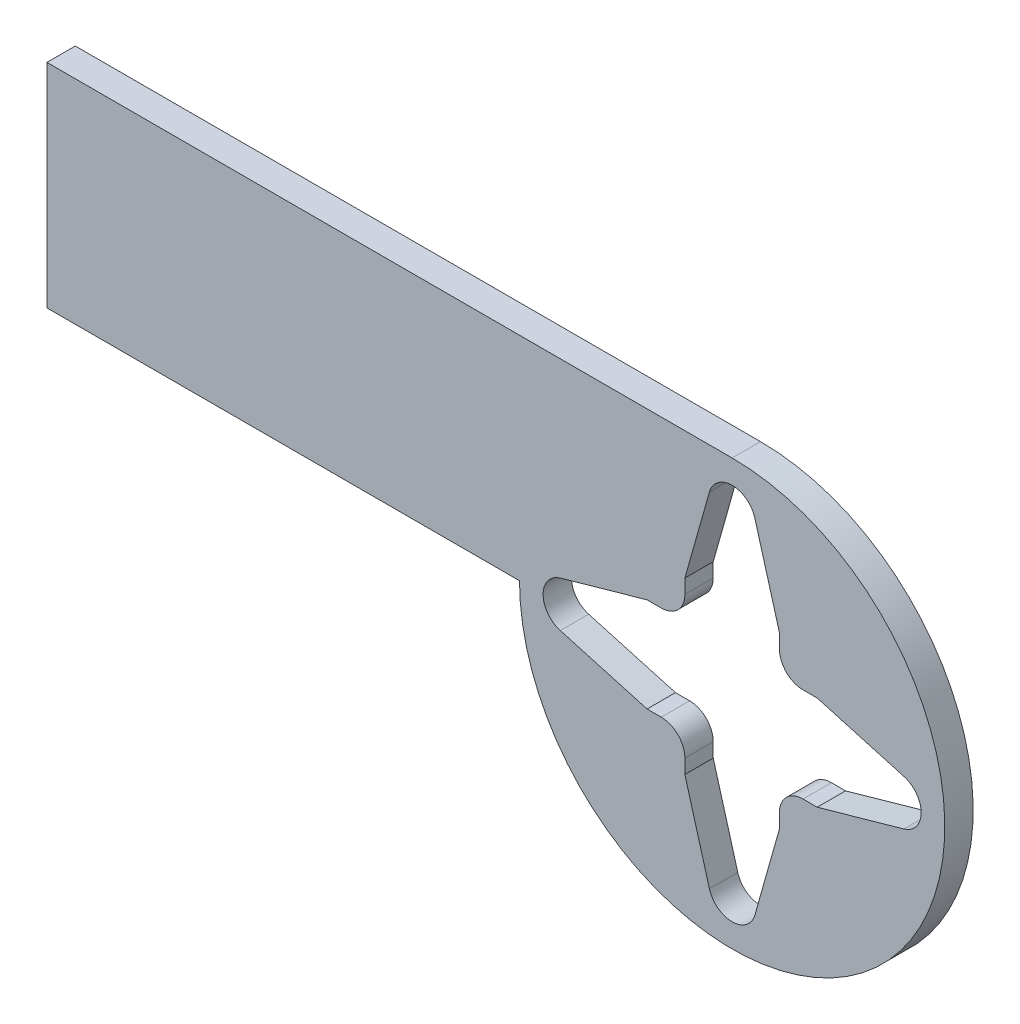
ISO-10303-21;
HEADER;
FILE_DESCRIPTION(('STEP AP214'),'2;1');
FILE_NAME('part.step','',(''),(''),'','','');
FILE_SCHEMA(('AUTOMOTIVE_DESIGN { 1 0 10303 214 1 1 1 1 }'));
ENDSEC;
DATA;
#1=APPLICATION_CONTEXT('core data for automotive mechanical design processes');
#2=APPLICATION_PROTOCOL_DEFINITION('international standard','automotive_design',2000,#1);
#3=PRODUCT_CONTEXT('',#1,'mechanical');
#4=PRODUCT('Part','Part','',(#3));
#5=PRODUCT_RELATED_PRODUCT_CATEGORY('part','',(#4));
#6=PRODUCT_DEFINITION_FORMATION('','',#4);
#7=PRODUCT_DEFINITION_CONTEXT('part definition',#1,'design');
#8=PRODUCT_DEFINITION('design','',#6,#7);
#9=PRODUCT_DEFINITION_SHAPE('','',#8);
#10=(LENGTH_UNIT() NAMED_UNIT(*) SI_UNIT(.MILLI.,.METRE.));
#11=(NAMED_UNIT(*) PLANE_ANGLE_UNIT() SI_UNIT($,.RADIAN.));
#12=(NAMED_UNIT(*) SI_UNIT($,.STERADIAN.) SOLID_ANGLE_UNIT());
#13=UNCERTAINTY_MEASURE_WITH_UNIT(LENGTH_MEASURE(1.E-05),#10,'distance_accuracy_value','');
#14=(GEOMETRIC_REPRESENTATION_CONTEXT(3) GLOBAL_UNCERTAINTY_ASSIGNED_CONTEXT((#13)) GLOBAL_UNIT_ASSIGNED_CONTEXT((#10,
#11,#12)) REPRESENTATION_CONTEXT('',''));
#15=CARTESIAN_POINT('',(0.,0.,0.));
#16=DIRECTION('',(0.,0.,1.));
#17=DIRECTION('',(1.,0.,0.));
#18=AXIS2_PLACEMENT_3D('',#15,#16,#17);
#19=CARTESIAN_POINT('',(0.,0.,3.));
#20=DIRECTION('',(0.,0.,-1.));
#21=DIRECTION('',(-1.,0.,0.));
#22=AXIS2_PLACEMENT_3D('',#19,#20,#21);
#23=CYLINDRICAL_SURFACE('',#22,22.5);
#24=CARTESIAN_POINT('',(0.,0.,0.));
#25=DIRECTION('',(0.,0.,1.));
#26=DIRECTION('',(1.,0.,0.));
#27=AXIS2_PLACEMENT_3D('',#24,#25,#26);
#28=CIRCLE('',#27,22.5);
#29=CARTESIAN_POINT('',(-22.5,0.,0.));
#30=VERTEX_POINT('',#29);
#31=CARTESIAN_POINT('',(0.,22.5,0.));
#32=VERTEX_POINT('',#31);
#33=EDGE_CURVE('E395',#30,#32,#28,.T.);
#34=ORIENTED_EDGE('',*,*,#33,.T.);
#35=DIRECTION('',(0.,0.,-1.));
#36=VECTOR('',#35,1.);
#37=CARTESIAN_POINT('',(0.,22.5,3.));
#38=LINE('',#37,#36);
#39=CARTESIAN_POINT('',(0.,22.5,3.));
#40=VERTEX_POINT('',#39);
#41=EDGE_CURVE('E142',#40,#32,#38,.T.);
#42=ORIENTED_EDGE('',*,*,#41,.F.);
#43=CARTESIAN_POINT('',(0.,0.,3.));
#44=DIRECTION('',(0.,0.,1.));
#45=DIRECTION('',(1.,0.,0.));
#46=AXIS2_PLACEMENT_3D('',#43,#44,#45);
#47=CIRCLE('',#46,22.5);
#48=CARTESIAN_POINT('',(-22.5,0.,3.));
#49=VERTEX_POINT('',#48);
#50=EDGE_CURVE('E391',#49,#40,#47,.T.);
#51=ORIENTED_EDGE('',*,*,#50,.F.);
#52=DIRECTION('',(0.,0.,-1.));
#53=VECTOR('',#52,1.);
#54=CARTESIAN_POINT('',(-22.5,0.,3.));
#55=LINE('',#54,#53);
#56=EDGE_CURVE('E12',#49,#30,#55,.T.);
#57=ORIENTED_EDGE('',*,*,#56,.T.);
#58=EDGE_LOOP('',(#34,#42,#51,#57));
#59=FACE_BOUND('',#58,.T.);
#60=ADVANCED_FACE('F131',(#59),#23,.T.);
#61=CARTESIAN_POINT('',(5.,0.,3.));
#62=DIRECTION('',(1.,0.,0.));
#63=DIRECTION('',(0.,0.,-1.));
#64=AXIS2_PLACEMENT_3D('',#61,#62,#63);
#65=PLANE('',#64);
#66=DIRECTION('',(0.,-1.,0.));
#67=VECTOR('',#66,1.);
#68=CARTESIAN_POINT('',(5.,0.,0.));
#69=LINE('',#68,#67);
#70=CARTESIAN_POINT('',(5.,-7.5,0.));
#71=VERTEX_POINT('',#70);
#72=CARTESIAN_POINT('',(5.,-9.,0.));
#73=VERTEX_POINT('',#72);
#74=EDGE_CURVE('E313',#71,#73,#69,.T.);
#75=ORIENTED_EDGE('',*,*,#74,.T.);
#76=DIRECTION('',(0.,0.,-1.));
#77=VECTOR('',#76,1.);
#78=CARTESIAN_POINT('',(5.,-9.,3.));
#79=LINE('',#78,#77);
#80=CARTESIAN_POINT('',(5.,-9.,3.));
#81=VERTEX_POINT('',#80);
#82=EDGE_CURVE('E317',#81,#73,#79,.T.);
#83=ORIENTED_EDGE('',*,*,#82,.F.);
#84=DIRECTION('',(0.,-1.,0.));
#85=VECTOR('',#84,1.);
#86=CARTESIAN_POINT('',(5.,0.,3.));
#87=LINE('',#86,#85);
#88=CARTESIAN_POINT('',(5.,-7.5,3.));
#89=VERTEX_POINT('',#88);
#90=EDGE_CURVE('E398',#89,#81,#87,.T.);
#91=ORIENTED_EDGE('',*,*,#90,.F.);
#92=DIRECTION('',(0.,0.,-1.));
#93=VECTOR('',#92,1.);
#94=CARTESIAN_POINT('',(5.,-7.5,3.));
#95=LINE('',#94,#93);
#96=EDGE_CURVE('E314',#89,#71,#95,.T.);
#97=ORIENTED_EDGE('',*,*,#96,.T.);
#98=EDGE_LOOP('',(#75,#83,#91,#97));
#99=FACE_BOUND('',#98,.T.);
#100=ADVANCED_FACE('F566',(#99),#65,.F.);
#101=CARTESIAN_POINT('',(6.98551163473582,-1.97409711694024,3.));
#102=DIRECTION('',(0.962311898410698,-0.271948175535705,0.));
#103=DIRECTION('',(0.271948175535705,0.962311898410698,0.));
#104=AXIS2_PLACEMENT_3D('',#101,#102,#103);
#105=PLANE('',#104);
#106=DIRECTION('',(-0.271948175535705,-0.962311898410698,0.));
#107=VECTOR('',#106,1.);
#108=CARTESIAN_POINT('',(6.98551163473582,-1.97409711694024,0.));
#109=LINE('',#108,#107);
#110=CARTESIAN_POINT('',(2.40577974602674,-18.1798704388393,0.));
#111=VERTEX_POINT('',#110);
#112=EDGE_CURVE('E467',#73,#111,#109,.T.);
#113=ORIENTED_EDGE('',*,*,#112,.T.);
#114=DIRECTION('',(0.,0.,-1.));
#115=VECTOR('',#114,1.);
#116=CARTESIAN_POINT('',(2.40577974602674,-18.1798704388393,3.));
#117=LINE('',#116,#115);
#118=CARTESIAN_POINT('',(2.40577974602674,-18.1798704388393,3.));
#119=VERTEX_POINT('',#118);
#120=EDGE_CURVE('E321',#119,#111,#117,.T.);
#121=ORIENTED_EDGE('',*,*,#120,.F.);
#122=DIRECTION('',(-0.271948175535705,-0.962311898410698,0.));
#123=VECTOR('',#122,1.);
#124=CARTESIAN_POINT('',(6.98551163473582,-1.97409711694024,3.));
#125=LINE('',#124,#123);
#126=EDGE_CURVE('E547',#81,#119,#125,.T.);
#127=ORIENTED_EDGE('',*,*,#126,.F.);
#128=ORIENTED_EDGE('',*,*,#82,.T.);
#129=EDGE_LOOP('',(#113,#121,#127,#128));
#130=FACE_BOUND('',#129,.T.);
#131=ADVANCED_FACE('F570',(#130),#105,.F.);
#132=CARTESIAN_POINT('',(0.,-17.5,3.));
#133=DIRECTION('',(0.,0.,-1.));
#134=DIRECTION('',(-1.,0.,0.));
#135=AXIS2_PLACEMENT_3D('',#132,#133,#134);
#136=CYLINDRICAL_SURFACE('',#135,2.5);
#137=CARTESIAN_POINT('',(0.,-17.5,0.));
#138=DIRECTION('',(0.,0.,1.));
#139=DIRECTION('',(1.,0.,0.));
#140=AXIS2_PLACEMENT_3D('',#137,#138,#139);
#141=CIRCLE('',#140,2.5);
#142=CARTESIAN_POINT('',(-2.40577974602674,-18.1798704388393,0.));
#143=VERTEX_POINT('',#142);
#144=EDGE_CURVE('E463',#111,#143,#141,.F.);
#145=ORIENTED_EDGE('',*,*,#144,.T.);
#146=DIRECTION('',(0.,0.,-1.));
#147=VECTOR('',#146,1.);
#148=CARTESIAN_POINT('',(-2.40577974602674,-18.1798704388393,3.));
#149=LINE('',#148,#147);
#150=CARTESIAN_POINT('',(-2.40577974602674,-18.1798704388393,3.));
#151=VERTEX_POINT('',#150);
#152=EDGE_CURVE('E325',#151,#143,#149,.T.);
#153=ORIENTED_EDGE('',*,*,#152,.F.);
#154=CARTESIAN_POINT('',(0.,-17.5,3.));
#155=DIRECTION('',(0.,0.,1.));
#156=DIRECTION('',(1.,0.,0.));
#157=AXIS2_PLACEMENT_3D('',#154,#155,#156);
#158=CIRCLE('',#157,2.5);
#159=EDGE_CURVE('E543',#119,#151,#158,.F.);
#160=ORIENTED_EDGE('',*,*,#159,.F.);
#161=ORIENTED_EDGE('',*,*,#120,.T.);
#162=EDGE_LOOP('',(#145,#153,#160,#161));
#163=FACE_BOUND('',#162,.T.);
#164=ADVANCED_FACE('F577',(#163),#136,.F.);
#165=CARTESIAN_POINT('',(-6.98551163473582,-1.97409711694024,3.));
#166=DIRECTION('',(0.962311898410698,0.271948175535705,0.));
#167=DIRECTION('',(-0.271948175535705,0.962311898410698,0.));
#168=AXIS2_PLACEMENT_3D('',#165,#166,#167);
#169=PLANE('',#168);
#170=DIRECTION('',(0.271948175535705,-0.962311898410698,0.));
#171=VECTOR('',#170,1.);
#172=CARTESIAN_POINT('',(-6.98551163473582,-1.97409711694024,0.));
#173=LINE('',#172,#171);
#174=CARTESIAN_POINT('',(-5.,-9.,0.));
#175=VERTEX_POINT('',#174);
#176=EDGE_CURVE('E459',#175,#143,#173,.T.);
#177=ORIENTED_EDGE('',*,*,#176,.F.);
#178=DIRECTION('',(0.,0.,-1.));
#179=VECTOR('',#178,1.);
#180=CARTESIAN_POINT('',(-5.,-9.,3.));
#181=LINE('',#180,#179);
#182=CARTESIAN_POINT('',(-5.,-9.,3.));
#183=VERTEX_POINT('',#182);
#184=EDGE_CURVE('E328',#183,#175,#181,.T.);
#185=ORIENTED_EDGE('',*,*,#184,.F.);
#186=DIRECTION('',(0.271948175535705,-0.962311898410698,0.));
#187=VECTOR('',#186,1.);
#188=CARTESIAN_POINT('',(-6.98551163473582,-1.97409711694024,3.));
#189=LINE('',#188,#187);
#190=EDGE_CURVE('E539',#183,#151,#189,.T.);
#191=ORIENTED_EDGE('',*,*,#190,.T.);
#192=ORIENTED_EDGE('',*,*,#152,.T.);
#193=EDGE_LOOP('',(#177,#185,#191,#192));
#194=FACE_BOUND('',#193,.T.);
#195=ADVANCED_FACE('F649',(#194),#169,.T.);
#196=CARTESIAN_POINT('',(-5.,0.,3.));
#197=DIRECTION('',(1.,0.,0.));
#198=DIRECTION('',(0.,0.,-1.));
#199=AXIS2_PLACEMENT_3D('',#196,#197,#198);
#200=PLANE('',#199);
#201=DIRECTION('',(0.,-1.,0.));
#202=VECTOR('',#201,1.);
#203=CARTESIAN_POINT('',(-5.,0.,0.));
#204=LINE('',#203,#202);
#205=CARTESIAN_POINT('',(-5.,-7.5,0.));
#206=VERTEX_POINT('',#205);
#207=EDGE_CURVE('E455',#206,#175,#204,.T.);
#208=ORIENTED_EDGE('',*,*,#207,.F.);
#209=DIRECTION('',(0.,0.,-1.));
#210=VECTOR('',#209,1.);
#211=CARTESIAN_POINT('',(-5.,-7.5,3.));
#212=LINE('',#211,#210);
#213=CARTESIAN_POINT('',(-5.,-7.5,3.));
#214=VERTEX_POINT('',#213);
#215=EDGE_CURVE('E331',#214,#206,#212,.T.);
#216=ORIENTED_EDGE('',*,*,#215,.F.);
#217=DIRECTION('',(0.,-1.,0.));
#218=VECTOR('',#217,1.);
#219=CARTESIAN_POINT('',(-5.,0.,3.));
#220=LINE('',#219,#218);
#221=EDGE_CURVE('E535',#214,#183,#220,.T.);
#222=ORIENTED_EDGE('',*,*,#221,.T.);
#223=ORIENTED_EDGE('',*,*,#184,.T.);
#224=EDGE_LOOP('',(#208,#216,#222,#223));
#225=FACE_BOUND('',#224,.T.);
#226=ADVANCED_FACE('F651',(#225),#200,.T.);
#227=CARTESIAN_POINT('',(0.,-5.,3.));
#228=DIRECTION('',(0.,-1.,0.));
#229=DIRECTION('',(1.,0.,0.));
#230=AXIS2_PLACEMENT_3D('',#227,#228,#229);
#231=PLANE('',#230);
#232=DIRECTION('',(-1.,0.,0.));
#233=VECTOR('',#232,1.);
#234=CARTESIAN_POINT('',(0.,-5.,0.));
#235=LINE('',#234,#233);
#236=CARTESIAN_POINT('',(-7.5,-5.,0.));
#237=VERTEX_POINT('',#236);
#238=CARTESIAN_POINT('',(-9.,-5.,0.));
#239=VERTEX_POINT('',#238);
#240=EDGE_CURVE('E452',#237,#239,#235,.T.);
#241=ORIENTED_EDGE('',*,*,#240,.T.);
#242=DIRECTION('',(0.,0.,-1.));
#243=VECTOR('',#242,1.);
#244=CARTESIAN_POINT('',(-9.,-5.,3.));
#245=LINE('',#244,#243);
#246=CARTESIAN_POINT('',(-9.,-5.,3.));
#247=VERTEX_POINT('',#246);
#248=EDGE_CURVE('E337',#247,#239,#245,.T.);
#249=ORIENTED_EDGE('',*,*,#248,.F.);
#250=DIRECTION('',(-1.,0.,0.));
#251=VECTOR('',#250,1.);
#252=CARTESIAN_POINT('',(0.,-5.,3.));
#253=LINE('',#252,#251);
#254=CARTESIAN_POINT('',(-7.5,-5.,3.));
#255=VERTEX_POINT('',#254);
#256=EDGE_CURVE('E531',#255,#247,#253,.T.);
#257=ORIENTED_EDGE('',*,*,#256,.F.);
#258=DIRECTION('',(0.,0.,-1.));
#259=VECTOR('',#258,1.);
#260=CARTESIAN_POINT('',(-7.5,-5.,3.));
#261=LINE('',#260,#259);
#262=EDGE_CURVE('E334',#255,#237,#261,.T.);
#263=ORIENTED_EDGE('',*,*,#262,.T.);
#264=EDGE_LOOP('',(#241,#249,#257,#263));
#265=FACE_BOUND('',#264,.T.);
#266=ADVANCED_FACE('F657',(#265),#231,.F.);
#267=CARTESIAN_POINT('',(-1.97409711694023,-6.98551163473581,3.));
#268=DIRECTION('',(-0.271948175535704,-0.962311898410698,0.));
#269=DIRECTION('',(0.962311898410698,-0.271948175535704,0.));
#270=AXIS2_PLACEMENT_3D('',#267,#268,#269);
#271=PLANE('',#270);
#272=DIRECTION('',(-0.962311898410698,0.271948175535704,0.));
#273=VECTOR('',#272,1.);
#274=CARTESIAN_POINT('',(-1.97409711694023,-6.98551163473581,0.));
#275=LINE('',#274,#273);
#276=CARTESIAN_POINT('',(-18.1798704388393,-2.40577974602675,0.));
#277=VERTEX_POINT('',#276);
#278=EDGE_CURVE('E449',#239,#277,#275,.T.);
#279=ORIENTED_EDGE('',*,*,#278,.T.);
#280=DIRECTION('',(0.,0.,-1.));
#281=VECTOR('',#280,1.);
#282=CARTESIAN_POINT('',(-18.1798704388393,-2.40577974602675,3.));
#283=LINE('',#282,#281);
#284=CARTESIAN_POINT('',(-18.1798704388393,-2.40577974602675,3.));
#285=VERTEX_POINT('',#284);
#286=EDGE_CURVE('E341',#285,#277,#283,.T.);
#287=ORIENTED_EDGE('',*,*,#286,.F.);
#288=DIRECTION('',(-0.962311898410698,0.271948175535704,0.));
#289=VECTOR('',#288,1.);
#290=CARTESIAN_POINT('',(-1.97409711694023,-6.98551163473581,3.));
#291=LINE('',#290,#289);
#292=EDGE_CURVE('E527',#247,#285,#291,.T.);
#293=ORIENTED_EDGE('',*,*,#292,.F.);
#294=ORIENTED_EDGE('',*,*,#248,.T.);
#295=EDGE_LOOP('',(#279,#287,#293,#294));
#296=FACE_BOUND('',#295,.T.);
#297=ADVANCED_FACE('F664',(#296),#271,.F.);
#298=CARTESIAN_POINT('',(-17.5,0.,3.));
#299=DIRECTION('',(0.,0.,-1.));
#300=DIRECTION('',(-1.,0.,0.));
#301=AXIS2_PLACEMENT_3D('',#298,#299,#300);
#302=CYLINDRICAL_SURFACE('',#301,2.5);
#303=CARTESIAN_POINT('',(-17.5,0.,0.));
#304=DIRECTION('',(0.,0.,1.));
#305=DIRECTION('',(1.,0.,0.));
#306=AXIS2_PLACEMENT_3D('',#303,#304,#305);
#307=CIRCLE('',#306,2.5);
#308=CARTESIAN_POINT('',(-18.1798704388393,2.40577974602675,0.));
#309=VERTEX_POINT('',#308);
#310=EDGE_CURVE('E445',#277,#309,#307,.F.);
#311=ORIENTED_EDGE('',*,*,#310,.T.);
#312=DIRECTION('',(0.,0.,-1.));
#313=VECTOR('',#312,1.);
#314=CARTESIAN_POINT('',(-18.1798704388393,2.40577974602675,3.));
#315=LINE('',#314,#313);
#316=CARTESIAN_POINT('',(-18.1798704388393,2.40577974602675,3.));
#317=VERTEX_POINT('',#316);
#318=EDGE_CURVE('E345',#317,#309,#315,.T.);
#319=ORIENTED_EDGE('',*,*,#318,.F.);
#320=CARTESIAN_POINT('',(-17.5,0.,3.));
#321=DIRECTION('',(0.,0.,1.));
#322=DIRECTION('',(1.,0.,0.));
#323=AXIS2_PLACEMENT_3D('',#320,#321,#322);
#324=CIRCLE('',#323,2.5);
#325=EDGE_CURVE('E523',#285,#317,#324,.F.);
#326=ORIENTED_EDGE('',*,*,#325,.F.);
#327=ORIENTED_EDGE('',*,*,#286,.T.);
#328=EDGE_LOOP('',(#311,#319,#326,#327));
#329=FACE_BOUND('',#328,.T.);
#330=ADVANCED_FACE('F670',(#329),#302,.F.);
#331=CARTESIAN_POINT('',(-1.97409711694023,6.98551163473581,3.));
#332=DIRECTION('',(0.271948175535704,-0.962311898410698,0.));
#333=DIRECTION('',(0.962311898410698,0.271948175535704,0.));
#334=AXIS2_PLACEMENT_3D('',#331,#332,#333);
#335=PLANE('',#334);
#336=DIRECTION('',(-0.962311898410698,-0.271948175535704,0.));
#337=VECTOR('',#336,1.);
#338=CARTESIAN_POINT('',(-1.97409711694023,6.98551163473581,0.));
#339=LINE('',#338,#337);
#340=CARTESIAN_POINT('',(-9.,5.,0.));
#341=VERTEX_POINT('',#340);
#342=EDGE_CURVE('E441',#341,#309,#339,.T.);
#343=ORIENTED_EDGE('',*,*,#342,.F.);
#344=DIRECTION('',(0.,0.,-1.));
#345=VECTOR('',#344,1.);
#346=CARTESIAN_POINT('',(-9.,5.,3.));
#347=LINE('',#346,#345);
#348=CARTESIAN_POINT('',(-9.,5.,3.));
#349=VERTEX_POINT('',#348);
#350=EDGE_CURVE('E348',#349,#341,#347,.T.);
#351=ORIENTED_EDGE('',*,*,#350,.F.);
#352=DIRECTION('',(-0.962311898410698,-0.271948175535704,0.));
#353=VECTOR('',#352,1.);
#354=CARTESIAN_POINT('',(-1.97409711694023,6.98551163473581,3.));
#355=LINE('',#354,#353);
#356=EDGE_CURVE('E519',#349,#317,#355,.T.);
#357=ORIENTED_EDGE('',*,*,#356,.T.);
#358=ORIENTED_EDGE('',*,*,#318,.T.);
#359=EDGE_LOOP('',(#343,#351,#357,#358));
#360=FACE_BOUND('',#359,.T.);
#361=ADVANCED_FACE('F674',(#360),#335,.T.);
#362=CARTESIAN_POINT('',(0.,5.,3.));
#363=DIRECTION('',(0.,-1.,0.));
#364=DIRECTION('',(1.,0.,0.));
#365=AXIS2_PLACEMENT_3D('',#362,#363,#364);
#366=PLANE('',#365);
#367=DIRECTION('',(-1.,0.,0.));
#368=VECTOR('',#367,1.);
#369=CARTESIAN_POINT('',(0.,5.,0.));
#370=LINE('',#369,#368);
#371=CARTESIAN_POINT('',(-7.5,5.,0.));
#372=VERTEX_POINT('',#371);
#373=EDGE_CURVE('E437',#372,#341,#370,.T.);
#374=ORIENTED_EDGE('',*,*,#373,.F.);
#375=DIRECTION('',(0.,0.,-1.));
#376=VECTOR('',#375,1.);
#377=CARTESIAN_POINT('',(-7.5,5.,3.));
#378=LINE('',#377,#376);
#379=CARTESIAN_POINT('',(-7.5,5.,3.));
#380=VERTEX_POINT('',#379);
#381=EDGE_CURVE('E351',#380,#372,#378,.T.);
#382=ORIENTED_EDGE('',*,*,#381,.F.);
#383=DIRECTION('',(-1.,0.,0.));
#384=VECTOR('',#383,1.);
#385=CARTESIAN_POINT('',(0.,5.,3.));
#386=LINE('',#385,#384);
#387=EDGE_CURVE('E515',#380,#349,#386,.T.);
#388=ORIENTED_EDGE('',*,*,#387,.T.);
#389=ORIENTED_EDGE('',*,*,#350,.T.);
#390=EDGE_LOOP('',(#374,#382,#388,#389));
#391=FACE_BOUND('',#390,.T.);
#392=ADVANCED_FACE('F677',(#391),#366,.T.);
#393=CARTESIAN_POINT('',(-5.,0.,3.));
#394=DIRECTION('',(-1.,0.,0.));
#395=DIRECTION('',(0.,0.,1.));
#396=AXIS2_PLACEMENT_3D('',#393,#394,#395);
#397=PLANE('',#396);
#398=DIRECTION('',(0.,1.,0.));
#399=VECTOR('',#398,1.);
#400=CARTESIAN_POINT('',(-5.,0.,0.));
#401=LINE('',#400,#399);
#402=CARTESIAN_POINT('',(-5.,7.5,0.));
#403=VERTEX_POINT('',#402);
#404=CARTESIAN_POINT('',(-5.,9.,0.));
#405=VERTEX_POINT('',#404);
#406=EDGE_CURVE('E434',#403,#405,#401,.T.);
#407=ORIENTED_EDGE('',*,*,#406,.T.);
#408=DIRECTION('',(0.,0.,-1.));
#409=VECTOR('',#408,1.);
#410=CARTESIAN_POINT('',(-5.,9.,3.));
#411=LINE('',#410,#409);
#412=CARTESIAN_POINT('',(-5.,9.,3.));
#413=VERTEX_POINT('',#412);
#414=EDGE_CURVE('E357',#413,#405,#411,.T.);
#415=ORIENTED_EDGE('',*,*,#414,.F.);
#416=DIRECTION('',(0.,1.,0.));
#417=VECTOR('',#416,1.);
#418=CARTESIAN_POINT('',(-5.,0.,3.));
#419=LINE('',#418,#417);
#420=CARTESIAN_POINT('',(-5.,7.5,3.));
#421=VERTEX_POINT('',#420);
#422=EDGE_CURVE('E511',#421,#413,#419,.T.);
#423=ORIENTED_EDGE('',*,*,#422,.F.);
#424=DIRECTION('',(0.,0.,-1.));
#425=VECTOR('',#424,1.);
#426=CARTESIAN_POINT('',(-5.,7.5,3.));
#427=LINE('',#426,#425);
#428=EDGE_CURVE('E354',#421,#403,#427,.T.);
#429=ORIENTED_EDGE('',*,*,#428,.T.);
#430=EDGE_LOOP('',(#407,#415,#423,#429));
#431=FACE_BOUND('',#430,.T.);
#432=ADVANCED_FACE('F683',(#431),#397,.F.);
#433=CARTESIAN_POINT('',(-6.98551163473582,1.97409711694024,3.));
#434=DIRECTION('',(-0.962311898410698,0.271948175535705,0.));
#435=DIRECTION('',(-0.271948175535705,-0.962311898410698,0.));
#436=AXIS2_PLACEMENT_3D('',#433,#434,#435);
#437=PLANE('',#436);
#438=DIRECTION('',(0.271948175535705,0.962311898410698,0.));
#439=VECTOR('',#438,1.);
#440=CARTESIAN_POINT('',(-6.98551163473582,1.97409711694024,0.));
#441=LINE('',#440,#439);
#442=CARTESIAN_POINT('',(-2.40577974602674,18.1798704388393,0.));
#443=VERTEX_POINT('',#442);
#444=EDGE_CURVE('E430',#405,#443,#441,.T.);
#445=ORIENTED_EDGE('',*,*,#444,.T.);
#446=DIRECTION('',(0.,0.,-1.));
#447=VECTOR('',#446,1.);
#448=CARTESIAN_POINT('',(-2.40577974602674,18.1798704388393,3.));
#449=LINE('',#448,#447);
#450=CARTESIAN_POINT('',(-2.40577974602674,18.1798704388393,3.));
#451=VERTEX_POINT('',#450);
#452=EDGE_CURVE('E361',#451,#443,#449,.T.);
#453=ORIENTED_EDGE('',*,*,#452,.F.);
#454=DIRECTION('',(0.271948175535705,0.962311898410698,0.));
#455=VECTOR('',#454,1.);
#456=CARTESIAN_POINT('',(-6.98551163473582,1.97409711694024,3.));
#457=LINE('',#456,#455);
#458=EDGE_CURVE('E507',#413,#451,#457,.T.);
#459=ORIENTED_EDGE('',*,*,#458,.F.);
#460=ORIENTED_EDGE('',*,*,#414,.T.);
#461=EDGE_LOOP('',(#445,#453,#459,#460));
#462=FACE_BOUND('',#461,.T.);
#463=ADVANCED_FACE('F689',(#462),#437,.F.);
#464=CARTESIAN_POINT('',(0.,17.5,3.));
#465=DIRECTION('',(0.,0.,-1.));
#466=DIRECTION('',(-1.,0.,0.));
#467=AXIS2_PLACEMENT_3D('',#464,#465,#466);
#468=CYLINDRICAL_SURFACE('',#467,2.5);
#469=CARTESIAN_POINT('',(0.,17.5,0.));
#470=DIRECTION('',(0.,0.,1.));
#471=DIRECTION('',(1.,0.,0.));
#472=AXIS2_PLACEMENT_3D('',#469,#470,#471);
#473=CIRCLE('',#472,2.5);
#474=CARTESIAN_POINT('',(2.40577974602674,18.1798704388393,0.));
#475=VERTEX_POINT('',#474);
#476=EDGE_CURVE('E426',#475,#443,#473,.T.);
#477=ORIENTED_EDGE('',*,*,#476,.F.);
#478=DIRECTION('',(0.,0.,-1.));
#479=VECTOR('',#478,1.);
#480=CARTESIAN_POINT('',(2.40577974602674,18.1798704388393,3.));
#481=LINE('',#480,#479);
#482=CARTESIAN_POINT('',(2.40577974602674,18.1798704388393,3.));
#483=VERTEX_POINT('',#482);
#484=EDGE_CURVE('E364',#483,#475,#481,.T.);
#485=ORIENTED_EDGE('',*,*,#484,.F.);
#486=CARTESIAN_POINT('',(0.,17.5,3.));
#487=DIRECTION('',(0.,0.,1.));
#488=DIRECTION('',(1.,0.,0.));
#489=AXIS2_PLACEMENT_3D('',#486,#487,#488);
#490=CIRCLE('',#489,2.5);
#491=EDGE_CURVE('E503',#483,#451,#490,.T.);
#492=ORIENTED_EDGE('',*,*,#491,.T.);
#493=ORIENTED_EDGE('',*,*,#452,.T.);
#494=EDGE_LOOP('',(#477,#485,#492,#493));
#495=FACE_BOUND('',#494,.T.);
#496=ADVANCED_FACE('F760',(#495),#468,.F.);
#497=CARTESIAN_POINT('',(6.98551163473582,1.97409711694024,3.));
#498=DIRECTION('',(-0.962311898410698,-0.271948175535705,0.));
#499=DIRECTION('',(0.271948175535705,-0.962311898410698,0.));
#500=AXIS2_PLACEMENT_3D('',#497,#498,#499);
#501=PLANE('',#500);
#502=DIRECTION('',(-0.271948175535705,0.962311898410698,0.));
#503=VECTOR('',#502,1.);
#504=CARTESIAN_POINT('',(6.98551163473582,1.97409711694024,0.));
#505=LINE('',#504,#503);
#506=CARTESIAN_POINT('',(5.,9.,0.));
#507=VERTEX_POINT('',#506);
#508=EDGE_CURVE('E422',#507,#475,#505,.T.);
#509=ORIENTED_EDGE('',*,*,#508,.F.);
#510=DIRECTION('',(0.,0.,-1.));
#511=VECTOR('',#510,1.);
#512=CARTESIAN_POINT('',(5.,9.,3.));
#513=LINE('',#512,#511);
#514=CARTESIAN_POINT('',(5.,9.,3.));
#515=VERTEX_POINT('',#514);
#516=EDGE_CURVE('E367',#515,#507,#513,.T.);
#517=ORIENTED_EDGE('',*,*,#516,.F.);
#518=DIRECTION('',(-0.271948175535705,0.962311898410698,0.));
#519=VECTOR('',#518,1.);
#520=CARTESIAN_POINT('',(6.98551163473582,1.97409711694024,3.));
#521=LINE('',#520,#519);
#522=EDGE_CURVE('E499',#515,#483,#521,.T.);
#523=ORIENTED_EDGE('',*,*,#522,.T.);
#524=ORIENTED_EDGE('',*,*,#484,.T.);
#525=EDGE_LOOP('',(#509,#517,#523,#524));
#526=FACE_BOUND('',#525,.T.);
#527=ADVANCED_FACE('F696',(#526),#501,.T.);
#528=CARTESIAN_POINT('',(5.,0.,3.));
#529=DIRECTION('',(-1.,0.,0.));
#530=DIRECTION('',(0.,0.,1.));
#531=AXIS2_PLACEMENT_3D('',#528,#529,#530);
#532=PLANE('',#531);
#533=DIRECTION('',(0.,1.,0.));
#534=VECTOR('',#533,1.);
#535=CARTESIAN_POINT('',(5.,0.,0.));
#536=LINE('',#535,#534);
#537=CARTESIAN_POINT('',(5.,7.5,0.));
#538=VERTEX_POINT('',#537);
#539=EDGE_CURVE('E418',#538,#507,#536,.T.);
#540=ORIENTED_EDGE('',*,*,#539,.F.);
#541=DIRECTION('',(0.,0.,-1.));
#542=VECTOR('',#541,1.);
#543=CARTESIAN_POINT('',(5.,7.5,3.));
#544=LINE('',#543,#542);
#545=CARTESIAN_POINT('',(5.,7.5,3.));
#546=VERTEX_POINT('',#545);
#547=EDGE_CURVE('E370',#546,#538,#544,.T.);
#548=ORIENTED_EDGE('',*,*,#547,.F.);
#549=DIRECTION('',(0.,1.,0.));
#550=VECTOR('',#549,1.);
#551=CARTESIAN_POINT('',(5.,0.,3.));
#552=LINE('',#551,#550);
#553=EDGE_CURVE('E495',#546,#515,#552,.T.);
#554=ORIENTED_EDGE('',*,*,#553,.T.);
#555=ORIENTED_EDGE('',*,*,#516,.T.);
#556=EDGE_LOOP('',(#540,#548,#554,#555));
#557=FACE_BOUND('',#556,.T.);
#558=ADVANCED_FACE('F700',(#557),#532,.T.);
#559=CARTESIAN_POINT('',(0.,5.,3.));
#560=DIRECTION('',(0.,1.,0.));
#561=DIRECTION('',(-1.,0.,0.));
#562=AXIS2_PLACEMENT_3D('',#559,#560,#561);
#563=PLANE('',#562);
#564=DIRECTION('',(1.,0.,0.));
#565=VECTOR('',#564,1.);
#566=CARTESIAN_POINT('',(0.,5.,0.));
#567=LINE('',#566,#565);
#568=CARTESIAN_POINT('',(7.5,5.,0.));
#569=VERTEX_POINT('',#568);
#570=CARTESIAN_POINT('',(9.,5.,0.));
#571=VERTEX_POINT('',#570);
#572=EDGE_CURVE('E415',#569,#571,#567,.T.);
#573=ORIENTED_EDGE('',*,*,#572,.T.);
#574=DIRECTION('',(0.,0.,-1.));
#575=VECTOR('',#574,1.);
#576=CARTESIAN_POINT('',(9.,5.,3.));
#577=LINE('',#576,#575);
#578=CARTESIAN_POINT('',(9.,5.,3.));
#579=VERTEX_POINT('',#578);
#580=EDGE_CURVE('E376',#579,#571,#577,.T.);
#581=ORIENTED_EDGE('',*,*,#580,.F.);
#582=DIRECTION('',(1.,0.,0.));
#583=VECTOR('',#582,1.);
#584=CARTESIAN_POINT('',(0.,5.,3.));
#585=LINE('',#584,#583);
#586=CARTESIAN_POINT('',(7.5,5.,3.));
#587=VERTEX_POINT('',#586);
#588=EDGE_CURVE('E491',#587,#579,#585,.T.);
#589=ORIENTED_EDGE('',*,*,#588,.F.);
#590=DIRECTION('',(0.,0.,-1.));
#591=VECTOR('',#590,1.);
#592=CARTESIAN_POINT('',(7.5,5.,3.));
#593=LINE('',#592,#591);
#594=EDGE_CURVE('E373',#587,#569,#593,.T.);
#595=ORIENTED_EDGE('',*,*,#594,.T.);
#596=EDGE_LOOP('',(#573,#581,#589,#595));
#597=FACE_BOUND('',#596,.T.);
#598=ADVANCED_FACE('F706',(#597),#563,.F.);
#599=CARTESIAN_POINT('',(1.97409711694023,6.98551163473581,3.));
#600=DIRECTION('',(0.271948175535704,0.962311898410698,0.));
#601=DIRECTION('',(-0.962311898410698,0.271948175535704,0.));
#602=AXIS2_PLACEMENT_3D('',#599,#600,#601);
#603=PLANE('',#602);
#604=DIRECTION('',(0.962311898410698,-0.271948175535704,0.));
#605=VECTOR('',#604,1.);
#606=CARTESIAN_POINT('',(1.97409711694023,6.98551163473581,0.));
#607=LINE('',#606,#605);
#608=CARTESIAN_POINT('',(18.1798704388393,2.40577974602675,0.));
#609=VERTEX_POINT('',#608);
#610=EDGE_CURVE('E411',#571,#609,#607,.T.);
#611=ORIENTED_EDGE('',*,*,#610,.T.);
#612=DIRECTION('',(0.,0.,-1.));
#613=VECTOR('',#612,1.);
#614=CARTESIAN_POINT('',(18.1798704388393,2.40577974602675,3.));
#615=LINE('',#614,#613);
#616=CARTESIAN_POINT('',(18.1798704388393,2.40577974602675,3.));
#617=VERTEX_POINT('',#616);
#618=EDGE_CURVE('E380',#617,#609,#615,.T.);
#619=ORIENTED_EDGE('',*,*,#618,.F.);
#620=DIRECTION('',(0.962311898410698,-0.271948175535704,0.));
#621=VECTOR('',#620,1.);
#622=CARTESIAN_POINT('',(1.97409711694023,6.98551163473581,3.));
#623=LINE('',#622,#621);
#624=EDGE_CURVE('E487',#579,#617,#623,.T.);
#625=ORIENTED_EDGE('',*,*,#624,.F.);
#626=ORIENTED_EDGE('',*,*,#580,.T.);
#627=EDGE_LOOP('',(#611,#619,#625,#626));
#628=FACE_BOUND('',#627,.T.);
#629=ADVANCED_FACE('F713',(#628),#603,.F.);
#630=CARTESIAN_POINT('',(17.5,0.,3.));
#631=DIRECTION('',(0.,0.,-1.));
#632=DIRECTION('',(-1.,0.,0.));
#633=AXIS2_PLACEMENT_3D('',#630,#631,#632);
#634=CYLINDRICAL_SURFACE('',#633,2.5);
#635=CARTESIAN_POINT('',(17.5,0.,0.));
#636=DIRECTION('',(0.,0.,1.));
#637=DIRECTION('',(1.,0.,0.));
#638=AXIS2_PLACEMENT_3D('',#635,#636,#637);
#639=CIRCLE('',#638,2.5);
#640=CARTESIAN_POINT('',(18.1798704388393,-2.40577974602675,0.));
#641=VERTEX_POINT('',#640);
#642=EDGE_CURVE('E407',#641,#609,#639,.T.);
#643=ORIENTED_EDGE('',*,*,#642,.F.);
#644=DIRECTION('',(0.,0.,-1.));
#645=VECTOR('',#644,1.);
#646=CARTESIAN_POINT('',(18.1798704388393,-2.40577974602675,3.));
#647=LINE('',#646,#645);
#648=CARTESIAN_POINT('',(18.1798704388393,-2.40577974602675,3.));
#649=VERTEX_POINT('',#648);
#650=EDGE_CURVE('E383',#649,#641,#647,.T.);
#651=ORIENTED_EDGE('',*,*,#650,.F.);
#652=CARTESIAN_POINT('',(17.5,0.,3.));
#653=DIRECTION('',(0.,0.,1.));
#654=DIRECTION('',(1.,0.,0.));
#655=AXIS2_PLACEMENT_3D('',#652,#653,#654);
#656=CIRCLE('',#655,2.5);
#657=EDGE_CURVE('E483',#649,#617,#656,.T.);
#658=ORIENTED_EDGE('',*,*,#657,.T.);
#659=ORIENTED_EDGE('',*,*,#618,.T.);
#660=EDGE_LOOP('',(#643,#651,#658,#659));
#661=FACE_BOUND('',#660,.T.);
#662=ADVANCED_FACE('F715',(#661),#634,.F.);
#663=CARTESIAN_POINT('',(1.97409711694023,-6.98551163473581,3.));
#664=DIRECTION('',(-0.271948175535704,0.962311898410698,0.));
#665=DIRECTION('',(-0.962311898410698,-0.271948175535704,0.));
#666=AXIS2_PLACEMENT_3D('',#663,#664,#665);
#667=PLANE('',#666);
#668=DIRECTION('',(0.962311898410698,0.271948175535704,0.));
#669=VECTOR('',#668,1.);
#670=CARTESIAN_POINT('',(1.97409711694023,-6.98551163473581,0.));
#671=LINE('',#670,#669);
#672=CARTESIAN_POINT('',(9.,-5.,0.));
#673=VERTEX_POINT('',#672);
#674=EDGE_CURVE('E403',#673,#641,#671,.T.);
#675=ORIENTED_EDGE('',*,*,#674,.F.);
#676=DIRECTION('',(0.,0.,-1.));
#677=VECTOR('',#676,1.);
#678=CARTESIAN_POINT('',(9.,-5.,3.));
#679=LINE('',#678,#677);
#680=CARTESIAN_POINT('',(9.,-5.,3.));
#681=VERTEX_POINT('',#680);
#682=EDGE_CURVE('E386',#681,#673,#679,.T.);
#683=ORIENTED_EDGE('',*,*,#682,.F.);
#684=DIRECTION('',(0.962311898410698,0.271948175535704,0.));
#685=VECTOR('',#684,1.);
#686=CARTESIAN_POINT('',(1.97409711694023,-6.98551163473581,3.));
#687=LINE('',#686,#685);
#688=EDGE_CURVE('E479',#681,#649,#687,.T.);
#689=ORIENTED_EDGE('',*,*,#688,.T.);
#690=ORIENTED_EDGE('',*,*,#650,.T.);
#691=EDGE_LOOP('',(#675,#683,#689,#690));
#692=FACE_BOUND('',#691,.T.);
#693=ADVANCED_FACE('F643',(#692),#667,.T.);
#694=CARTESIAN_POINT('',(0.,-5.,3.));
#695=DIRECTION('',(0.,1.,0.));
#696=DIRECTION('',(0.,0.,1.));
#697=AXIS2_PLACEMENT_3D('',#694,#695,#696);
#698=PLANE('',#697);
#699=DIRECTION('',(1.,0.,0.));
#700=VECTOR('',#699,1.);
#701=CARTESIAN_POINT('',(0.,-5.,0.));
#702=LINE('',#701,#700);
#703=CARTESIAN_POINT('',(7.5,-5.,0.));
#704=VERTEX_POINT('',#703);
#705=EDGE_CURVE('E399',#704,#673,#702,.T.);
#706=ORIENTED_EDGE('',*,*,#705,.F.);
#707=DIRECTION('',(0.,0.,-1.));
#708=VECTOR('',#707,1.);
#709=CARTESIAN_POINT('',(7.5,-5.,3.));
#710=LINE('',#709,#708);
#711=CARTESIAN_POINT('',(7.5,-5.,3.));
#712=VERTEX_POINT('',#711);
#713=EDGE_CURVE('E389',#712,#704,#710,.T.);
#714=ORIENTED_EDGE('',*,*,#713,.F.);
#715=DIRECTION('',(1.,0.,0.));
#716=VECTOR('',#715,1.);
#717=CARTESIAN_POINT('',(0.,-5.,3.));
#718=LINE('',#717,#716);
#719=EDGE_CURVE('E475',#712,#681,#718,.T.);
#720=ORIENTED_EDGE('',*,*,#719,.T.);
#721=ORIENTED_EDGE('',*,*,#682,.T.);
#722=EDGE_LOOP('',(#706,#714,#720,#721));
#723=FACE_BOUND('',#722,.T.);
#724=ADVANCED_FACE('F634',(#723),#698,.T.);
#725=CARTESIAN_POINT('',(0.,0.,0.));
#726=DIRECTION('',(0.,0.,1.));
#727=DIRECTION('',(1.,0.,0.));
#728=AXIS2_PLACEMENT_3D('',#725,#726,#727);
#729=PLANE('',#728);
#730=ORIENTED_EDGE('',*,*,#74,.F.);
#731=CARTESIAN_POINT('',(7.5,-7.5,0.));
#732=DIRECTION('',(0.,0.,1.));
#733=DIRECTION('',(1.,0.,0.));
#734=AXIS2_PLACEMENT_3D('',#731,#732,#733);
#735=CIRCLE('',#734,2.5);
#736=EDGE_CURVE('E289',#704,#71,#735,.T.);
#737=ORIENTED_EDGE('',*,*,#736,.F.);
#738=ORIENTED_EDGE('',*,*,#705,.T.);
#739=ORIENTED_EDGE('',*,*,#674,.T.);
#740=ORIENTED_EDGE('',*,*,#642,.T.);
#741=ORIENTED_EDGE('',*,*,#610,.F.);
#742=ORIENTED_EDGE('',*,*,#572,.F.);
#743=CARTESIAN_POINT('',(7.5,7.5,0.));
#744=DIRECTION('',(0.,0.,-1.));
#745=DIRECTION('',(-1.,0.,0.));
#746=AXIS2_PLACEMENT_3D('',#743,#744,#745);
#747=CIRCLE('',#746,2.5);
#748=EDGE_CURVE('E297',#569,#538,#747,.T.);
#749=ORIENTED_EDGE('',*,*,#748,.T.);
#750=ORIENTED_EDGE('',*,*,#539,.T.);
#751=ORIENTED_EDGE('',*,*,#508,.T.);
#752=ORIENTED_EDGE('',*,*,#476,.T.);
#753=ORIENTED_EDGE('',*,*,#444,.F.);
#754=ORIENTED_EDGE('',*,*,#406,.F.);
#755=CARTESIAN_POINT('',(-7.5,7.5,0.));
#756=DIRECTION('',(0.,0.,1.));
#757=DIRECTION('',(1.,0.,0.));
#758=AXIS2_PLACEMENT_3D('',#755,#756,#757);
#759=CIRCLE('',#758,2.5);
#760=EDGE_CURVE('E305',#372,#403,#759,.T.);
#761=ORIENTED_EDGE('',*,*,#760,.F.);
#762=ORIENTED_EDGE('',*,*,#373,.T.);
#763=ORIENTED_EDGE('',*,*,#342,.T.);
#764=ORIENTED_EDGE('',*,*,#310,.F.);
#765=ORIENTED_EDGE('',*,*,#278,.F.);
#766=ORIENTED_EDGE('',*,*,#240,.F.);
#767=CARTESIAN_POINT('',(-7.5,-7.5,0.));
#768=DIRECTION('',(0.,0.,-1.));
#769=DIRECTION('',(-1.,0.,0.));
#770=AXIS2_PLACEMENT_3D('',#767,#768,#769);
#771=CIRCLE('',#770,2.5);
#772=EDGE_CURVE('E281',#237,#206,#771,.T.);
#773=ORIENTED_EDGE('',*,*,#772,.T.);
#774=ORIENTED_EDGE('',*,*,#207,.T.);
#775=ORIENTED_EDGE('',*,*,#176,.T.);
#776=ORIENTED_EDGE('',*,*,#144,.F.);
#777=ORIENTED_EDGE('',*,*,#112,.F.);
#778=EDGE_LOOP('',(#730,#737,#738,#739,#740,#741,#742,#749,#750,#751,#752,#753,#754,#761,#762,
#763,#764,#765,#766,#773,#774,#775,#776,#777));
#779=FACE_BOUND('',#778,.T.);
#780=ORIENTED_EDGE('',*,*,#33,.F.);
#781=DIRECTION('',(-1.,0.,0.));
#782=VECTOR('',#781,1.);
#783=CARTESIAN_POINT('',(-22.5,0.,0.));
#784=LINE('',#783,#782);
#785=CARTESIAN_POINT('',(-72.5,0.,0.));
#786=VERTEX_POINT('',#785);
#787=EDGE_CURVE('E268',#30,#786,#784,.T.);
#788=ORIENTED_EDGE('',*,*,#787,.T.);
#789=DIRECTION('',(0.,-1.,0.));
#790=VECTOR('',#789,1.);
#791=CARTESIAN_POINT('',(-72.5,22.5,0.));
#792=LINE('',#791,#790);
#793=CARTESIAN_POINT('',(-72.5,22.5,0.));
#794=VERTEX_POINT('',#793);
#795=EDGE_CURVE('E263',#794,#786,#792,.T.);
#796=ORIENTED_EDGE('',*,*,#795,.F.);
#797=DIRECTION('',(1.,0.,0.));
#798=VECTOR('',#797,1.);
#799=CARTESIAN_POINT('',(-22.5,22.5,0.));
#800=LINE('',#799,#798);
#801=EDGE_CURVE('E250',#794,#32,#800,.T.);
#802=ORIENTED_EDGE('',*,*,#801,.T.);
#803=EDGE_LOOP('',(#780,#788,#796,#802));
#804=FACE_BOUND('',#803,.T.);
#805=ADVANCED_FACE('F267',(#779,#804),#729,.F.);
#806=CARTESIAN_POINT('',(0.,0.,3.));
#807=DIRECTION('',(0.,0.,1.));
#808=DIRECTION('',(1.,0.,0.));
#809=AXIS2_PLACEMENT_3D('',#806,#807,#808);
#810=PLANE('',#809);
#811=ORIENTED_EDGE('',*,*,#719,.F.);
#812=CARTESIAN_POINT('',(7.5,-7.5,3.));
#813=DIRECTION('',(0.,0.,1.));
#814=DIRECTION('',(1.,0.,0.));
#815=AXIS2_PLACEMENT_3D('',#812,#813,#814);
#816=CIRCLE('',#815,2.5);
#817=EDGE_CURVE('E293',#712,#89,#816,.T.);
#818=ORIENTED_EDGE('',*,*,#817,.T.);
#819=ORIENTED_EDGE('',*,*,#90,.T.);
#820=ORIENTED_EDGE('',*,*,#126,.T.);
#821=ORIENTED_EDGE('',*,*,#159,.T.);
#822=ORIENTED_EDGE('',*,*,#190,.F.);
#823=ORIENTED_EDGE('',*,*,#221,.F.);
#824=CARTESIAN_POINT('',(-7.5,-7.5,3.));
#825=DIRECTION('',(0.,0.,-1.));
#826=DIRECTION('',(-1.,0.,0.));
#827=AXIS2_PLACEMENT_3D('',#824,#825,#826);
#828=CIRCLE('',#827,2.5);
#829=EDGE_CURVE('E285',#255,#214,#828,.T.);
#830=ORIENTED_EDGE('',*,*,#829,.F.);
#831=ORIENTED_EDGE('',*,*,#256,.T.);
#832=ORIENTED_EDGE('',*,*,#292,.T.);
#833=ORIENTED_EDGE('',*,*,#325,.T.);
#834=ORIENTED_EDGE('',*,*,#356,.F.);
#835=ORIENTED_EDGE('',*,*,#387,.F.);
#836=CARTESIAN_POINT('',(-7.5,7.5,3.));
#837=DIRECTION('',(0.,0.,1.));
#838=DIRECTION('',(1.,0.,0.));
#839=AXIS2_PLACEMENT_3D('',#836,#837,#838);
#840=CIRCLE('',#839,2.5);
#841=EDGE_CURVE('E309',#380,#421,#840,.T.);
#842=ORIENTED_EDGE('',*,*,#841,.T.);
#843=ORIENTED_EDGE('',*,*,#422,.T.);
#844=ORIENTED_EDGE('',*,*,#458,.T.);
#845=ORIENTED_EDGE('',*,*,#491,.F.);
#846=ORIENTED_EDGE('',*,*,#522,.F.);
#847=ORIENTED_EDGE('',*,*,#553,.F.);
#848=CARTESIAN_POINT('',(7.5,7.5,3.));
#849=DIRECTION('',(0.,0.,-1.));
#850=DIRECTION('',(-1.,0.,0.));
#851=AXIS2_PLACEMENT_3D('',#848,#849,#850);
#852=CIRCLE('',#851,2.5);
#853=EDGE_CURVE('E301',#587,#546,#852,.T.);
#854=ORIENTED_EDGE('',*,*,#853,.F.);
#855=ORIENTED_EDGE('',*,*,#588,.T.);
#856=ORIENTED_EDGE('',*,*,#624,.T.);
#857=ORIENTED_EDGE('',*,*,#657,.F.);
#858=ORIENTED_EDGE('',*,*,#688,.F.);
#859=EDGE_LOOP('',(#811,#818,#819,#820,#821,#822,#823,#830,#831,#832,#833,#834,#835,#842,#843,
#844,#845,#846,#847,#854,#855,#856,#857,#858));
#860=FACE_BOUND('',#859,.T.);
#861=ORIENTED_EDGE('',*,*,#50,.T.);
#862=DIRECTION('',(1.,0.,0.));
#863=VECTOR('',#862,1.);
#864=CARTESIAN_POINT('',(-22.5,22.5,3.));
#865=LINE('',#864,#863);
#866=CARTESIAN_POINT('',(-72.5,22.5,3.));
#867=VERTEX_POINT('',#866);
#868=EDGE_CURVE('E259',#867,#40,#865,.T.);
#869=ORIENTED_EDGE('',*,*,#868,.F.);
#870=DIRECTION('',(0.,-1.,0.));
#871=VECTOR('',#870,1.);
#872=CARTESIAN_POINT('',(-72.5,22.5,3.));
#873=LINE('',#872,#871);
#874=CARTESIAN_POINT('',(-72.5,0.,3.));
#875=VERTEX_POINT('',#874);
#876=EDGE_CURVE('E265',#867,#875,#873,.T.);
#877=ORIENTED_EDGE('',*,*,#876,.T.);
#878=DIRECTION('',(-1.,0.,0.));
#879=VECTOR('',#878,1.);
#880=CARTESIAN_POINT('',(-22.5,0.,3.));
#881=LINE('',#880,#879);
#882=EDGE_CURVE('E270',#49,#875,#881,.T.);
#883=ORIENTED_EDGE('',*,*,#882,.F.);
#884=EDGE_LOOP('',(#861,#869,#877,#883));
#885=FACE_BOUND('',#884,.T.);
#886=ADVANCED_FACE('F558',(#860,#885),#810,.T.);
#887=CARTESIAN_POINT('',(-72.5,22.5,3.));
#888=DIRECTION('',(1.,0.,0.));
#889=DIRECTION('',(0.,0.,-1.));
#890=AXIS2_PLACEMENT_3D('',#887,#888,#889);
#891=PLANE('',#890);
#892=ORIENTED_EDGE('',*,*,#795,.T.);
#893=DIRECTION('',(0.,0.,-1.));
#894=VECTOR('',#893,1.);
#895=CARTESIAN_POINT('',(-72.5,0.,3.));
#896=LINE('',#895,#894);
#897=EDGE_CURVE('E135',#875,#786,#896,.T.);
#898=ORIENTED_EDGE('',*,*,#897,.F.);
#899=ORIENTED_EDGE('',*,*,#876,.F.);
#900=DIRECTION('',(0.,0.,-1.));
#901=VECTOR('',#900,1.);
#902=CARTESIAN_POINT('',(-72.5,22.5,3.));
#903=LINE('',#902,#901);
#904=EDGE_CURVE('E253',#867,#794,#903,.T.);
#905=ORIENTED_EDGE('',*,*,#904,.T.);
#906=EDGE_LOOP('',(#892,#898,#899,#905));
#907=FACE_BOUND('',#906,.T.);
#908=ADVANCED_FACE('F262',(#907),#891,.F.);
#909=CARTESIAN_POINT('',(-22.5,22.5,3.));
#910=DIRECTION('',(0.,1.,0.));
#911=DIRECTION('',(0.,0.,1.));
#912=AXIS2_PLACEMENT_3D('',#909,#910,#911);
#913=PLANE('',#912);
#914=ORIENTED_EDGE('',*,*,#801,.F.);
#915=ORIENTED_EDGE('',*,*,#904,.F.);
#916=ORIENTED_EDGE('',*,*,#868,.T.);
#917=ORIENTED_EDGE('',*,*,#41,.T.);
#918=EDGE_LOOP('',(#914,#915,#916,#917));
#919=FACE_BOUND('',#918,.T.);
#920=ADVANCED_FACE('F252',(#919),#913,.T.);
#921=CARTESIAN_POINT('',(-22.5,0.,3.));
#922=DIRECTION('',(0.,-1.,0.));
#923=DIRECTION('',(1.,0.,0.));
#924=AXIS2_PLACEMENT_3D('',#921,#922,#923);
#925=PLANE('',#924);
#926=ORIENTED_EDGE('',*,*,#787,.F.);
#927=ORIENTED_EDGE('',*,*,#56,.F.);
#928=ORIENTED_EDGE('',*,*,#882,.T.);
#929=ORIENTED_EDGE('',*,*,#897,.T.);
#930=EDGE_LOOP('',(#926,#927,#928,#929));
#931=FACE_BOUND('',#930,.T.);
#932=ADVANCED_FACE('F133',(#931),#925,.T.);
#933=CARTESIAN_POINT('',(-7.5,-7.5,3.));
#934=DIRECTION('',(0.,0.,-1.));
#935=DIRECTION('',(-1.,0.,0.));
#936=AXIS2_PLACEMENT_3D('',#933,#934,#935);
#937=CYLINDRICAL_SURFACE('',#936,2.5);
#938=ORIENTED_EDGE('',*,*,#829,.T.);
#939=ORIENTED_EDGE('',*,*,#215,.T.);
#940=ORIENTED_EDGE('',*,*,#772,.F.);
#941=ORIENTED_EDGE('',*,*,#262,.F.);
#942=EDGE_LOOP('',(#938,#939,#940,#941));
#943=FACE_BOUND('',#942,.T.);
#944=ADVANCED_FACE('F725',(#943),#937,.T.);
#945=CARTESIAN_POINT('',(7.5,-7.5,3.));
#946=DIRECTION('',(0.,0.,-1.));
#947=DIRECTION('',(-1.,0.,0.));
#948=AXIS2_PLACEMENT_3D('',#945,#946,#947);
#949=CYLINDRICAL_SURFACE('',#948,2.5);
#950=ORIENTED_EDGE('',*,*,#736,.T.);
#951=ORIENTED_EDGE('',*,*,#96,.F.);
#952=ORIENTED_EDGE('',*,*,#817,.F.);
#953=ORIENTED_EDGE('',*,*,#713,.T.);
#954=EDGE_LOOP('',(#950,#951,#952,#953));
#955=FACE_BOUND('',#954,.T.);
#956=ADVANCED_FACE('F638',(#955),#949,.T.);
#957=CARTESIAN_POINT('',(7.5,7.5,3.));
#958=DIRECTION('',(0.,0.,-1.));
#959=DIRECTION('',(-1.,0.,0.));
#960=AXIS2_PLACEMENT_3D('',#957,#958,#959);
#961=CYLINDRICAL_SURFACE('',#960,2.5);
#962=ORIENTED_EDGE('',*,*,#853,.T.);
#963=ORIENTED_EDGE('',*,*,#547,.T.);
#964=ORIENTED_EDGE('',*,*,#748,.F.);
#965=ORIENTED_EDGE('',*,*,#594,.F.);
#966=EDGE_LOOP('',(#962,#963,#964,#965));
#967=FACE_BOUND('',#966,.T.);
#968=ADVANCED_FACE('F716',(#967),#961,.T.);
#969=CARTESIAN_POINT('',(-7.5,7.5,3.));
#970=DIRECTION('',(0.,0.,-1.));
#971=DIRECTION('',(-1.,0.,0.));
#972=AXIS2_PLACEMENT_3D('',#969,#970,#971);
#973=CYLINDRICAL_SURFACE('',#972,2.5);
#974=ORIENTED_EDGE('',*,*,#841,.F.);
#975=ORIENTED_EDGE('',*,*,#381,.T.);
#976=ORIENTED_EDGE('',*,*,#760,.T.);
#977=ORIENTED_EDGE('',*,*,#428,.F.);
#978=EDGE_LOOP('',(#974,#975,#976,#977));
#979=FACE_BOUND('',#978,.T.);
#980=ADVANCED_FACE('F718',(#979),#973,.T.);
#981=CLOSED_SHELL('',(#60,#100,#131,#164,#195,#226,#266,#297,#330,#361,#392,#432,#463,#496,#527,
#558,#598,#629,#662,#693,#724,#805,#886,#908,#920,#932,#944,#956,#968,#980));
#982=MANIFOLD_SOLID_BREP('B2',#981);
#983=ADVANCED_BREP_SHAPE_REPRESENTATION('',(#18,#982),#14);
#984=SHAPE_DEFINITION_REPRESENTATION(#9,#983);
ENDSEC;
END-ISO-10303-21;
